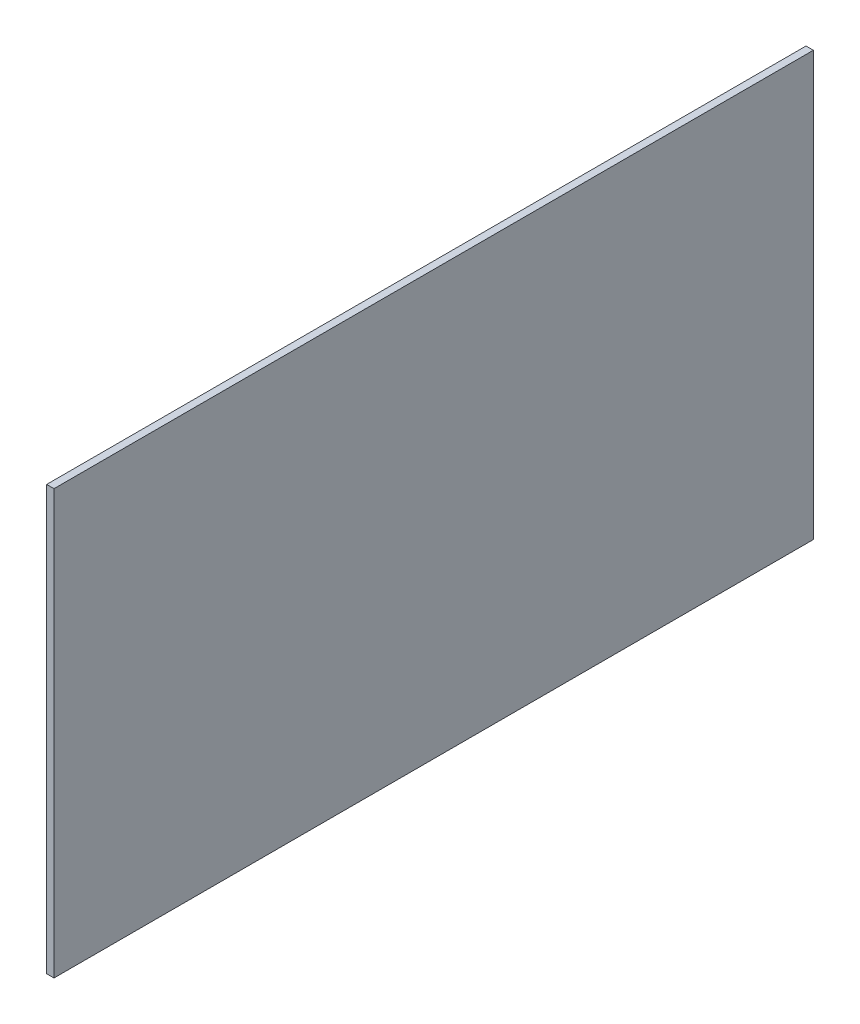
ISO-10303-21;
HEADER;
FILE_DESCRIPTION(('STEP AP214'),'2;1');
FILE_NAME('part.step','',(''),(''),'','','');
FILE_SCHEMA(('AUTOMOTIVE_DESIGN { 1 0 10303 214 1 1 1 1 }'));
ENDSEC;
DATA;
#1=APPLICATION_CONTEXT('core data for automotive mechanical design processes');
#2=APPLICATION_PROTOCOL_DEFINITION('international standard','automotive_design',2000,#1);
#3=PRODUCT_CONTEXT('',#1,'mechanical');
#4=PRODUCT('Part','Part','',(#3));
#5=PRODUCT_RELATED_PRODUCT_CATEGORY('part','',(#4));
#6=PRODUCT_DEFINITION_FORMATION('','',#4);
#7=PRODUCT_DEFINITION_CONTEXT('part definition',#1,'design');
#8=PRODUCT_DEFINITION('design','',#6,#7);
#9=PRODUCT_DEFINITION_SHAPE('','',#8);
#10=(LENGTH_UNIT() NAMED_UNIT(*) SI_UNIT(.MILLI.,.METRE.));
#11=(NAMED_UNIT(*) PLANE_ANGLE_UNIT() SI_UNIT($,.RADIAN.));
#12=(NAMED_UNIT(*) SI_UNIT($,.STERADIAN.) SOLID_ANGLE_UNIT());
#13=UNCERTAINTY_MEASURE_WITH_UNIT(LENGTH_MEASURE(1.E-05),#10,'distance_accuracy_value','');
#14=(GEOMETRIC_REPRESENTATION_CONTEXT(3) GLOBAL_UNCERTAINTY_ASSIGNED_CONTEXT((#13)) GLOBAL_UNIT_ASSIGNED_CONTEXT((#10,
#11,#12)) REPRESENTATION_CONTEXT('',''));
#15=CARTESIAN_POINT('',(0.,0.,0.));
#16=DIRECTION('',(0.,0.,1.));
#17=DIRECTION('',(1.,0.,0.));
#18=AXIS2_PLACEMENT_3D('',#15,#16,#17);
#19=CARTESIAN_POINT('',(4.7625,-137.31875,-246.0625));
#20=DIRECTION('',(0.,0.,1.));
#21=DIRECTION('',(1.,0.,0.));
#22=AXIS2_PLACEMENT_3D('',#19,#20,#21);
#23=PLANE('',#22);
#24=DIRECTION('',(0.,1.,0.));
#25=VECTOR('',#24,1.);
#26=CARTESIAN_POINT('',(0.,-137.31875,-246.0625));
#27=LINE('',#26,#25);
#28=CARTESIAN_POINT('',(0.,-137.31875,-246.0625));
#29=VERTEX_POINT('',#28);
#30=CARTESIAN_POINT('',(0.,137.31875,-246.0625));
#31=VERTEX_POINT('',#30);
#32=EDGE_CURVE('E95',#29,#31,#27,.T.);
#33=ORIENTED_EDGE('',*,*,#32,.T.);
#34=DIRECTION('',(-1.,0.,0.));
#35=VECTOR('',#34,1.);
#36=CARTESIAN_POINT('',(4.7625,137.31875,-246.0625));
#37=LINE('',#36,#35);
#38=CARTESIAN_POINT('',(4.7625,137.31875,-246.0625));
#39=VERTEX_POINT('',#38);
#40=EDGE_CURVE('E11',#39,#31,#37,.T.);
#41=ORIENTED_EDGE('',*,*,#40,.F.);
#42=DIRECTION('',(0.,1.,0.));
#43=VECTOR('',#42,1.);
#44=CARTESIAN_POINT('',(4.7625,-137.31875,-246.0625));
#45=LINE('',#44,#43);
#46=CARTESIAN_POINT('',(4.7625,-137.31875,-246.0625));
#47=VERTEX_POINT('',#46);
#48=EDGE_CURVE('E83',#47,#39,#45,.T.);
#49=ORIENTED_EDGE('',*,*,#48,.F.);
#50=DIRECTION('',(-1.,0.,0.));
#51=VECTOR('',#50,1.);
#52=CARTESIAN_POINT('',(4.7625,-137.31875,-246.0625));
#53=LINE('',#52,#51);
#54=EDGE_CURVE('E91',#47,#29,#53,.T.);
#55=ORIENTED_EDGE('',*,*,#54,.T.);
#56=EDGE_LOOP('',(#33,#41,#49,#55));
#57=FACE_BOUND('',#56,.T.);
#58=ADVANCED_FACE('F32',(#57),#23,.F.);
#59=CARTESIAN_POINT('',(4.7625,137.31875,246.0625));
#60=DIRECTION('',(0.,-1.,0.));
#61=DIRECTION('',(0.,0.,-1.));
#62=AXIS2_PLACEMENT_3D('',#59,#60,#61);
#63=PLANE('',#62);
#64=DIRECTION('',(0.,0.,1.));
#65=VECTOR('',#64,1.);
#66=CARTESIAN_POINT('',(0.,137.31875,246.0625));
#67=LINE('',#66,#65);
#68=CARTESIAN_POINT('',(0.,137.31875,246.0625));
#69=VERTEX_POINT('',#68);
#70=EDGE_CURVE('E87',#31,#69,#67,.T.);
#71=ORIENTED_EDGE('',*,*,#70,.T.);
#72=DIRECTION('',(-1.,0.,0.));
#73=VECTOR('',#72,1.);
#74=CARTESIAN_POINT('',(4.7625,137.31875,246.0625));
#75=LINE('',#74,#73);
#76=CARTESIAN_POINT('',(4.7625,137.31875,246.0625));
#77=VERTEX_POINT('',#76);
#78=EDGE_CURVE('E40',#77,#69,#75,.T.);
#79=ORIENTED_EDGE('',*,*,#78,.F.);
#80=DIRECTION('',(0.,0.,1.));
#81=VECTOR('',#80,1.);
#82=CARTESIAN_POINT('',(4.7625,137.31875,246.0625));
#83=LINE('',#82,#81);
#84=EDGE_CURVE('E78',#39,#77,#83,.T.);
#85=ORIENTED_EDGE('',*,*,#84,.F.);
#86=ORIENTED_EDGE('',*,*,#40,.T.);
#87=EDGE_LOOP('',(#71,#79,#85,#86));
#88=FACE_BOUND('',#87,.T.);
#89=ADVANCED_FACE('F86',(#88),#63,.F.);
#90=CARTESIAN_POINT('',(4.7625,-137.31875,246.0625));
#91=DIRECTION('',(0.,0.,-1.));
#92=DIRECTION('',(-1.,0.,0.));
#93=AXIS2_PLACEMENT_3D('',#90,#91,#92);
#94=PLANE('',#93);
#95=DIRECTION('',(0.,-1.,0.));
#96=VECTOR('',#95,1.);
#97=CARTESIAN_POINT('',(0.,-137.31875,246.0625));
#98=LINE('',#97,#96);
#99=CARTESIAN_POINT('',(0.,-137.31875,246.0625));
#100=VERTEX_POINT('',#99);
#101=EDGE_CURVE('E65',#69,#100,#98,.T.);
#102=ORIENTED_EDGE('',*,*,#101,.T.);
#103=DIRECTION('',(-1.,0.,0.));
#104=VECTOR('',#103,1.);
#105=CARTESIAN_POINT('',(4.7625,-137.31875,246.0625));
#106=LINE('',#105,#104);
#107=CARTESIAN_POINT('',(4.7625,-137.31875,246.0625));
#108=VERTEX_POINT('',#107);
#109=EDGE_CURVE('E88',#108,#100,#106,.T.);
#110=ORIENTED_EDGE('',*,*,#109,.F.);
#111=DIRECTION('',(0.,-1.,0.));
#112=VECTOR('',#111,1.);
#113=CARTESIAN_POINT('',(4.7625,-137.31875,246.0625));
#114=LINE('',#113,#112);
#115=EDGE_CURVE('E81',#77,#108,#114,.T.);
#116=ORIENTED_EDGE('',*,*,#115,.F.);
#117=ORIENTED_EDGE('',*,*,#78,.T.);
#118=EDGE_LOOP('',(#102,#110,#116,#117));
#119=FACE_BOUND('',#118,.T.);
#120=ADVANCED_FACE('F89',(#119),#94,.F.);
#121=CARTESIAN_POINT('',(4.7625,-137.31875,246.0625));
#122=DIRECTION('',(0.,1.,0.));
#123=DIRECTION('',(0.,0.,1.));
#124=AXIS2_PLACEMENT_3D('',#121,#122,#123);
#125=PLANE('',#124);
#126=DIRECTION('',(0.,0.,-1.));
#127=VECTOR('',#126,1.);
#128=CARTESIAN_POINT('',(0.,-137.31875,246.0625));
#129=LINE('',#128,#127);
#130=EDGE_CURVE('E71',#100,#29,#129,.T.);
#131=ORIENTED_EDGE('',*,*,#130,.T.);
#132=ORIENTED_EDGE('',*,*,#54,.F.);
#133=DIRECTION('',(0.,0.,-1.));
#134=VECTOR('',#133,1.);
#135=CARTESIAN_POINT('',(4.7625,-137.31875,246.0625));
#136=LINE('',#135,#134);
#137=EDGE_CURVE('E48',#108,#47,#136,.T.);
#138=ORIENTED_EDGE('',*,*,#137,.F.);
#139=ORIENTED_EDGE('',*,*,#109,.T.);
#140=EDGE_LOOP('',(#131,#132,#138,#139));
#141=FACE_BOUND('',#140,.T.);
#142=ADVANCED_FACE('F102',(#141),#125,.F.);
#143=CARTESIAN_POINT('',(4.7625,0.,0.));
#144=DIRECTION('',(-1.,0.,0.));
#145=DIRECTION('',(0.,0.,1.));
#146=AXIS2_PLACEMENT_3D('',#143,#144,#145);
#147=PLANE('',#146);
#148=ORIENTED_EDGE('',*,*,#48,.T.);
#149=ORIENTED_EDGE('',*,*,#84,.T.);
#150=ORIENTED_EDGE('',*,*,#115,.T.);
#151=ORIENTED_EDGE('',*,*,#137,.T.);
#152=EDGE_LOOP('',(#148,#149,#150,#151));
#153=FACE_BOUND('',#152,.T.);
#154=ADVANCED_FACE('F79',(#153),#147,.F.);
#155=CARTESIAN_POINT('',(0.,0.,0.));
#156=DIRECTION('',(-1.,0.,0.));
#157=DIRECTION('',(0.,0.,1.));
#158=AXIS2_PLACEMENT_3D('',#155,#156,#157);
#159=PLANE('',#158);
#160=ORIENTED_EDGE('',*,*,#32,.F.);
#161=ORIENTED_EDGE('',*,*,#130,.F.);
#162=ORIENTED_EDGE('',*,*,#101,.F.);
#163=ORIENTED_EDGE('',*,*,#70,.F.);
#164=EDGE_LOOP('',(#160,#161,#162,#163));
#165=FACE_BOUND('',#164,.T.);
#166=ADVANCED_FACE('F105',(#165),#159,.T.);
#167=CLOSED_SHELL('',(#58,#89,#120,#142,#154,#166));
#168=MANIFOLD_SOLID_BREP('B2',#167);
#169=ADVANCED_BREP_SHAPE_REPRESENTATION('',(#18,#168),#14);
#170=SHAPE_DEFINITION_REPRESENTATION(#9,#169);
ENDSEC;
END-ISO-10303-21;
